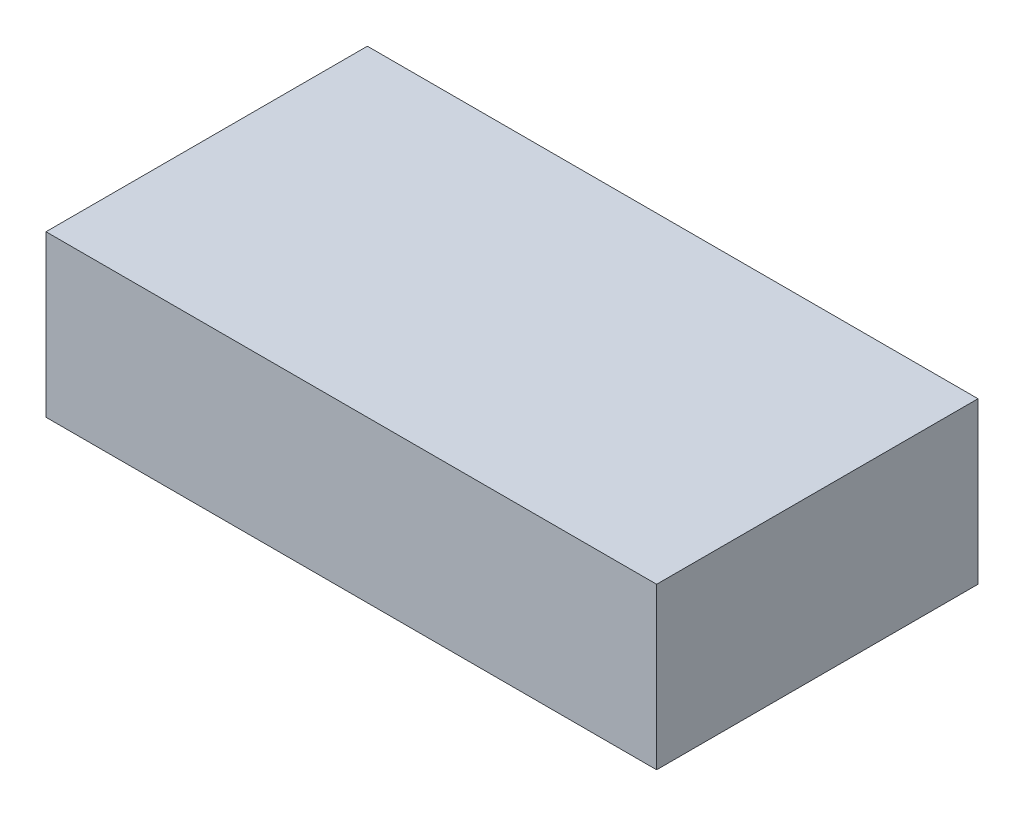
ISO-10303-21;
HEADER;
FILE_DESCRIPTION(('STEP AP214'),'2;1');
FILE_NAME('part.step','',(''),(''),'','','');
FILE_SCHEMA(('AUTOMOTIVE_DESIGN { 1 0 10303 214 1 1 1 1 }'));
ENDSEC;
DATA;
#1=APPLICATION_CONTEXT('core data for automotive mechanical design processes');
#2=APPLICATION_PROTOCOL_DEFINITION('international standard','automotive_design',2000,#1);
#3=PRODUCT_CONTEXT('',#1,'mechanical');
#4=PRODUCT('Part','Part','',(#3));
#5=PRODUCT_RELATED_PRODUCT_CATEGORY('part','',(#4));
#6=PRODUCT_DEFINITION_FORMATION('','',#4);
#7=PRODUCT_DEFINITION_CONTEXT('part definition',#1,'design');
#8=PRODUCT_DEFINITION('design','',#6,#7);
#9=PRODUCT_DEFINITION_SHAPE('','',#8);
#10=(LENGTH_UNIT() NAMED_UNIT(*) SI_UNIT(.MILLI.,.METRE.));
#11=(NAMED_UNIT(*) PLANE_ANGLE_UNIT() SI_UNIT($,.RADIAN.));
#12=(NAMED_UNIT(*) SI_UNIT($,.STERADIAN.) SOLID_ANGLE_UNIT());
#13=UNCERTAINTY_MEASURE_WITH_UNIT(LENGTH_MEASURE(1.E-05),#10,'distance_accuracy_value','');
#14=(GEOMETRIC_REPRESENTATION_CONTEXT(3) GLOBAL_UNCERTAINTY_ASSIGNED_CONTEXT((#13)) GLOBAL_UNIT_ASSIGNED_CONTEXT((#10,
#11,#12)) REPRESENTATION_CONTEXT('',''));
#15=CARTESIAN_POINT('',(0.,0.,0.));
#16=DIRECTION('',(0.,0.,1.));
#17=DIRECTION('',(1.,0.,0.));
#18=AXIS2_PLACEMENT_3D('',#15,#16,#17);
#19=CARTESIAN_POINT('',(28.5,15.,15.));
#20=DIRECTION('',(-1.,0.,0.));
#21=DIRECTION('',(0.,0.,1.));
#22=AXIS2_PLACEMENT_3D('',#19,#20,#21);
#23=PLANE('',#22);
#24=DIRECTION('',(0.,0.,-1.));
#25=VECTOR('',#24,1.);
#26=CARTESIAN_POINT('',(28.5,0.,15.));
#27=LINE('',#26,#25);
#28=CARTESIAN_POINT('',(28.5,0.,15.));
#29=VERTEX_POINT('',#28);
#30=CARTESIAN_POINT('',(28.5,0.,-15.));
#31=VERTEX_POINT('',#30);
#32=EDGE_CURVE('E109',#29,#31,#27,.T.);
#33=ORIENTED_EDGE('',*,*,#32,.T.);
#34=DIRECTION('',(0.,-1.,0.));
#35=VECTOR('',#34,1.);
#36=CARTESIAN_POINT('',(28.5,15.,-15.));
#37=LINE('',#36,#35);
#38=CARTESIAN_POINT('',(28.5,15.,-15.));
#39=VERTEX_POINT('',#38);
#40=EDGE_CURVE('E11',#39,#31,#37,.T.);
#41=ORIENTED_EDGE('',*,*,#40,.F.);
#42=DIRECTION('',(0.,0.,-1.));
#43=VECTOR('',#42,1.);
#44=CARTESIAN_POINT('',(28.5,15.,15.));
#45=LINE('',#44,#43);
#46=CARTESIAN_POINT('',(28.5,15.,15.));
#47=VERTEX_POINT('',#46);
#48=EDGE_CURVE('E93',#47,#39,#45,.T.);
#49=ORIENTED_EDGE('',*,*,#48,.F.);
#50=DIRECTION('',(0.,-1.,0.));
#51=VECTOR('',#50,1.);
#52=CARTESIAN_POINT('',(28.5,15.,15.));
#53=LINE('',#52,#51);
#54=EDGE_CURVE('E105',#47,#29,#53,.T.);
#55=ORIENTED_EDGE('',*,*,#54,.T.);
#56=EDGE_LOOP('',(#33,#41,#49,#55));
#57=FACE_BOUND('',#56,.T.);
#58=ADVANCED_FACE('F41',(#57),#23,.F.);
#59=CARTESIAN_POINT('',(-28.5,15.,-15.));
#60=DIRECTION('',(0.,0.,1.));
#61=DIRECTION('',(1.,0.,0.));
#62=AXIS2_PLACEMENT_3D('',#59,#60,#61);
#63=PLANE('',#62);
#64=DIRECTION('',(-1.,0.,0.));
#65=VECTOR('',#64,1.);
#66=CARTESIAN_POINT('',(-28.5,0.,-15.));
#67=LINE('',#66,#65);
#68=CARTESIAN_POINT('',(-28.5,0.,-15.));
#69=VERTEX_POINT('',#68);
#70=EDGE_CURVE('E98',#31,#69,#67,.T.);
#71=ORIENTED_EDGE('',*,*,#70,.T.);
#72=DIRECTION('',(0.,-1.,0.));
#73=VECTOR('',#72,1.);
#74=CARTESIAN_POINT('',(-28.5,15.,-15.));
#75=LINE('',#74,#73);
#76=CARTESIAN_POINT('',(-28.5,15.,-15.));
#77=VERTEX_POINT('',#76);
#78=EDGE_CURVE('E50',#77,#69,#75,.T.);
#79=ORIENTED_EDGE('',*,*,#78,.F.);
#80=DIRECTION('',(-1.,0.,0.));
#81=VECTOR('',#80,1.);
#82=CARTESIAN_POINT('',(-28.5,15.,-15.));
#83=LINE('',#82,#81);
#84=EDGE_CURVE('E88',#39,#77,#83,.T.);
#85=ORIENTED_EDGE('',*,*,#84,.F.);
#86=ORIENTED_EDGE('',*,*,#40,.T.);
#87=EDGE_LOOP('',(#71,#79,#85,#86));
#88=FACE_BOUND('',#87,.T.);
#89=ADVANCED_FACE('F97',(#88),#63,.F.);
#90=CARTESIAN_POINT('',(-28.5,15.,15.));
#91=DIRECTION('',(1.,0.,0.));
#92=DIRECTION('',(0.,0.,-1.));
#93=AXIS2_PLACEMENT_3D('',#90,#91,#92);
#94=PLANE('',#93);
#95=DIRECTION('',(0.,0.,1.));
#96=VECTOR('',#95,1.);
#97=CARTESIAN_POINT('',(-28.5,0.,15.));
#98=LINE('',#97,#96);
#99=CARTESIAN_POINT('',(-28.5,0.,15.));
#100=VERTEX_POINT('',#99);
#101=EDGE_CURVE('E75',#69,#100,#98,.T.);
#102=ORIENTED_EDGE('',*,*,#101,.T.);
#103=DIRECTION('',(0.,-1.,0.));
#104=VECTOR('',#103,1.);
#105=CARTESIAN_POINT('',(-28.5,15.,15.));
#106=LINE('',#105,#104);
#107=CARTESIAN_POINT('',(-28.5,15.,15.));
#108=VERTEX_POINT('',#107);
#109=EDGE_CURVE('E100',#108,#100,#106,.T.);
#110=ORIENTED_EDGE('',*,*,#109,.F.);
#111=DIRECTION('',(0.,0.,1.));
#112=VECTOR('',#111,1.);
#113=CARTESIAN_POINT('',(-28.5,15.,15.));
#114=LINE('',#113,#112);
#115=EDGE_CURVE('E91',#77,#108,#114,.T.);
#116=ORIENTED_EDGE('',*,*,#115,.F.);
#117=ORIENTED_EDGE('',*,*,#78,.T.);
#118=EDGE_LOOP('',(#102,#110,#116,#117));
#119=FACE_BOUND('',#118,.T.);
#120=ADVANCED_FACE('F101',(#119),#94,.F.);
#121=CARTESIAN_POINT('',(-28.5,15.,15.));
#122=DIRECTION('',(0.,0.,-1.));
#123=DIRECTION('',(-1.,0.,0.));
#124=AXIS2_PLACEMENT_3D('',#121,#122,#123);
#125=PLANE('',#124);
#126=DIRECTION('',(1.,0.,0.));
#127=VECTOR('',#126,1.);
#128=CARTESIAN_POINT('',(-28.5,0.,15.));
#129=LINE('',#128,#127);
#130=EDGE_CURVE('E81',#100,#29,#129,.T.);
#131=ORIENTED_EDGE('',*,*,#130,.T.);
#132=ORIENTED_EDGE('',*,*,#54,.F.);
#133=DIRECTION('',(1.,0.,0.));
#134=VECTOR('',#133,1.);
#135=CARTESIAN_POINT('',(-28.5,15.,15.));
#136=LINE('',#135,#134);
#137=EDGE_CURVE('E58',#108,#47,#136,.T.);
#138=ORIENTED_EDGE('',*,*,#137,.F.);
#139=ORIENTED_EDGE('',*,*,#109,.T.);
#140=EDGE_LOOP('',(#131,#132,#138,#139));
#141=FACE_BOUND('',#140,.T.);
#142=ADVANCED_FACE('F122',(#141),#125,.F.);
#143=CARTESIAN_POINT('',(0.,15.,0.));
#144=DIRECTION('',(0.,-1.,0.));
#145=DIRECTION('',(0.,0.,-1.));
#146=AXIS2_PLACEMENT_3D('',#143,#144,#145);
#147=PLANE('',#146);
#148=ORIENTED_EDGE('',*,*,#48,.T.);
#149=ORIENTED_EDGE('',*,*,#84,.T.);
#150=ORIENTED_EDGE('',*,*,#115,.T.);
#151=ORIENTED_EDGE('',*,*,#137,.T.);
#152=EDGE_LOOP('',(#148,#149,#150,#151));
#153=FACE_BOUND('',#152,.T.);
#154=ADVANCED_FACE('F89',(#153),#147,.F.);
#155=CARTESIAN_POINT('',(0.,0.,0.));
#156=DIRECTION('',(0.,-1.,0.));
#157=DIRECTION('',(0.,0.,-1.));
#158=AXIS2_PLACEMENT_3D('',#155,#156,#157);
#159=PLANE('',#158);
#160=ORIENTED_EDGE('',*,*,#32,.F.);
#161=ORIENTED_EDGE('',*,*,#130,.F.);
#162=ORIENTED_EDGE('',*,*,#101,.F.);
#163=ORIENTED_EDGE('',*,*,#70,.F.);
#164=EDGE_LOOP('',(#160,#161,#162,#163));
#165=FACE_BOUND('',#164,.T.);
#166=ADVANCED_FACE('F125',(#165),#159,.T.);
#167=CLOSED_SHELL('',(#58,#89,#120,#142,#154,#166));
#168=MANIFOLD_SOLID_BREP('B2',#167);
#169=ADVANCED_BREP_SHAPE_REPRESENTATION('',(#18,#168),#14);
#170=SHAPE_DEFINITION_REPRESENTATION(#9,#169);
ENDSEC;
END-ISO-10303-21;
